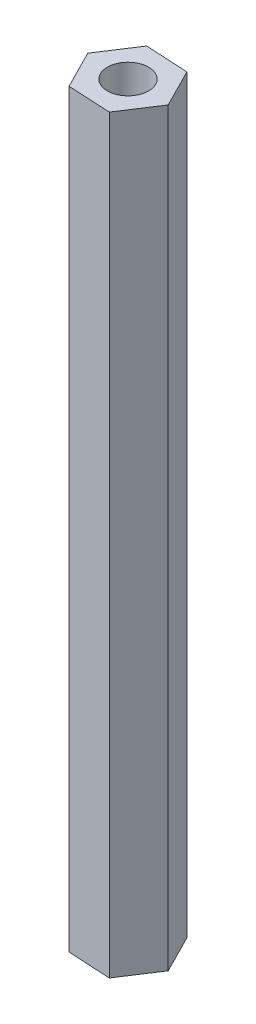
ISO-10303-21;
HEADER;
FILE_DESCRIPTION(('STEP AP214'),'2;1');
FILE_NAME('part.step','',(''),(''),'','','');
FILE_SCHEMA(('AUTOMOTIVE_DESIGN { 1 0 10303 214 1 1 1 1 }'));
ENDSEC;
DATA;
#1=APPLICATION_CONTEXT('core data for automotive mechanical design processes');
#2=APPLICATION_PROTOCOL_DEFINITION('international standard','automotive_design',2000,#1);
#3=PRODUCT_CONTEXT('',#1,'mechanical');
#4=PRODUCT('Part','Part','',(#3));
#5=PRODUCT_RELATED_PRODUCT_CATEGORY('part','',(#4));
#6=PRODUCT_DEFINITION_FORMATION('','',#4);
#7=PRODUCT_DEFINITION_CONTEXT('part definition',#1,'design');
#8=PRODUCT_DEFINITION('design','',#6,#7);
#9=PRODUCT_DEFINITION_SHAPE('','',#8);
#10=(LENGTH_UNIT() NAMED_UNIT(*) SI_UNIT(.MILLI.,.METRE.));
#11=(NAMED_UNIT(*) PLANE_ANGLE_UNIT() SI_UNIT($,.RADIAN.));
#12=(NAMED_UNIT(*) SI_UNIT($,.STERADIAN.) SOLID_ANGLE_UNIT());
#13=UNCERTAINTY_MEASURE_WITH_UNIT(LENGTH_MEASURE(1.E-05),#10,'distance_accuracy_value','');
#14=(GEOMETRIC_REPRESENTATION_CONTEXT(3) GLOBAL_UNCERTAINTY_ASSIGNED_CONTEXT((#13)) GLOBAL_UNIT_ASSIGNED_CONTEXT((#10,
#11,#12)) REPRESENTATION_CONTEXT('',''));
#15=CARTESIAN_POINT('',(0.,0.,0.));
#16=DIRECTION('',(0.,0.,1.));
#17=DIRECTION('',(1.,0.,0.));
#18=AXIS2_PLACEMENT_3D('',#15,#16,#17);
#19=CARTESIAN_POINT('',(1.54318664004275,60.,3.03675951094697));
#20=DIRECTION('',(-0.838083193513256,0.,-0.545542446332659));
#21=DIRECTION('',(-0.545542446332659,0.,0.838083193513256));
#22=AXIS2_PLACEMENT_3D('',#19,#20,#21);
#23=PLANE('',#22);
#24=DIRECTION('',(0.545542446332659,0.,-0.838083193513256));
#25=VECTOR('',#24,1.);
#26=CARTESIAN_POINT('',(1.54318664004275,0.,3.03675951094697));
#27=LINE('',#26,#25);
#28=CARTESIAN_POINT('',(1.54318664004275,0.,3.03675951094697));
#29=VERTEX_POINT('',#28);
#30=CARTESIAN_POINT('',(3.40150420168546,0.,0.181940922415713));
#31=VERTEX_POINT('',#30);
#32=EDGE_CURVE('E130',#29,#31,#27,.T.);
#33=ORIENTED_EDGE('',*,*,#32,.T.);
#34=DIRECTION('',(0.,-1.,0.));
#35=VECTOR('',#34,1.);
#36=CARTESIAN_POINT('',(3.40150420168546,60.,0.181940922415713));
#37=LINE('',#36,#35);
#38=CARTESIAN_POINT('',(3.40150420168546,60.,0.181940922415713));
#39=VERTEX_POINT('',#38);
#40=EDGE_CURVE('E11',#39,#31,#37,.T.);
#41=ORIENTED_EDGE('',*,*,#40,.F.);
#42=DIRECTION('',(0.545542446332659,0.,-0.838083193513256));
#43=VECTOR('',#42,1.);
#44=CARTESIAN_POINT('',(1.54318664004275,60.,3.03675951094697));
#45=LINE('',#44,#43);
#46=CARTESIAN_POINT('',(1.54318664004275,60.,3.03675951094697));
#47=VERTEX_POINT('',#46);
#48=EDGE_CURVE('E139',#47,#39,#45,.T.);
#49=ORIENTED_EDGE('',*,*,#48,.F.);
#50=DIRECTION('',(0.,-1.,0.));
#51=VECTOR('',#50,1.);
#52=CARTESIAN_POINT('',(1.54318664004275,60.,3.03675951094697));
#53=LINE('',#52,#51);
#54=EDGE_CURVE('E124',#47,#29,#53,.T.);
#55=ORIENTED_EDGE('',*,*,#54,.T.);
#56=EDGE_LOOP('',(#33,#41,#49,#55));
#57=FACE_BOUND('',#56,.T.);
#58=ADVANCED_FACE('F43',(#57),#23,.F.);
#59=CARTESIAN_POINT('',(3.40150420168546,60.,0.181940922415713));
#60=DIRECTION('',(-0.891495214123419,0.,0.45303011290094));
#61=DIRECTION('',(0.45303011290094,0.,0.891495214123419));
#62=AXIS2_PLACEMENT_3D('',#59,#60,#61);
#63=PLANE('',#62);
#64=DIRECTION('',(-0.45303011290094,0.,-0.891495214123419));
#65=VECTOR('',#64,1.);
#66=CARTESIAN_POINT('',(3.40150420168546,0.,0.181940922415713));
#67=LINE('',#66,#65);
#68=CARTESIAN_POINT('',(1.85831756164271,0.,-2.85481858853126));
#69=VERTEX_POINT('',#68);
#70=EDGE_CURVE('E128',#31,#69,#67,.T.);
#71=ORIENTED_EDGE('',*,*,#70,.T.);
#72=DIRECTION('',(0.,-1.,0.));
#73=VECTOR('',#72,1.);
#74=CARTESIAN_POINT('',(1.85831756164271,60.,-2.85481858853126));
#75=LINE('',#74,#73);
#76=CARTESIAN_POINT('',(1.85831756164271,60.,-2.85481858853126));
#77=VERTEX_POINT('',#76);
#78=EDGE_CURVE('E51',#77,#69,#75,.T.);
#79=ORIENTED_EDGE('',*,*,#78,.F.);
#80=DIRECTION('',(-0.45303011290094,0.,-0.891495214123419));
#81=VECTOR('',#80,1.);
#82=CARTESIAN_POINT('',(3.40150420168546,60.,0.181940922415713));
#83=LINE('',#82,#81);
#84=EDGE_CURVE('E96',#39,#77,#83,.T.);
#85=ORIENTED_EDGE('',*,*,#84,.F.);
#86=ORIENTED_EDGE('',*,*,#40,.T.);
#87=EDGE_LOOP('',(#71,#79,#85,#86));
#88=FACE_BOUND('',#87,.T.);
#89=ADVANCED_FACE('F162',(#88),#63,.F.);
#90=CARTESIAN_POINT('',(1.85831756164271,60.,-2.85481858853126));
#91=DIRECTION('',(-0.0534120206101634,0.,0.998572559233599));
#92=DIRECTION('',(0.998572559233599,0.,0.0534120206101634));
#93=AXIS2_PLACEMENT_3D('',#90,#91,#92);
#94=PLANE('',#93);
#95=DIRECTION('',(-0.998572559233599,0.,-0.0534120206101634));
#96=VECTOR('',#95,1.);
#97=CARTESIAN_POINT('',(1.85831756164271,0.,-2.85481858853126));
#98=LINE('',#97,#96);
#99=CARTESIAN_POINT('',(-1.54318664004275,0.,-3.03675951094697));
#100=VERTEX_POINT('',#99);
#101=EDGE_CURVE('E132',#69,#100,#98,.T.);
#102=ORIENTED_EDGE('',*,*,#101,.T.);
#103=DIRECTION('',(0.,-1.,0.));
#104=VECTOR('',#103,1.);
#105=CARTESIAN_POINT('',(-1.54318664004275,60.,-3.03675951094697));
#106=LINE('',#105,#104);
#107=CARTESIAN_POINT('',(-1.54318664004275,60.,-3.03675951094697));
#108=VERTEX_POINT('',#107);
#109=EDGE_CURVE('E117',#108,#100,#106,.T.);
#110=ORIENTED_EDGE('',*,*,#109,.F.);
#111=DIRECTION('',(-0.998572559233599,0.,-0.0534120206101634));
#112=VECTOR('',#111,1.);
#113=CARTESIAN_POINT('',(1.85831756164271,60.,-2.85481858853126));
#114=LINE('',#113,#112);
#115=EDGE_CURVE('E108',#77,#108,#114,.T.);
#116=ORIENTED_EDGE('',*,*,#115,.F.);
#117=ORIENTED_EDGE('',*,*,#78,.T.);
#118=EDGE_LOOP('',(#102,#110,#116,#117));
#119=FACE_BOUND('',#118,.T.);
#120=ADVANCED_FACE('F145',(#119),#94,.F.);
#121=CARTESIAN_POINT('',(-1.54318664004275,60.,-3.03675951094697));
#122=DIRECTION('',(0.838083193513256,0.,0.545542446332659));
#123=DIRECTION('',(0.545542446332659,0.,-0.838083193513256));
#124=AXIS2_PLACEMENT_3D('',#121,#122,#123);
#125=PLANE('',#124);
#126=DIRECTION('',(-0.545542446332659,0.,0.838083193513256));
#127=VECTOR('',#126,1.);
#128=CARTESIAN_POINT('',(-1.54318664004275,0.,-3.03675951094697));
#129=LINE('',#128,#127);
#130=CARTESIAN_POINT('',(-3.40150420168546,0.,-0.181940922415714));
#131=VERTEX_POINT('',#130);
#132=EDGE_CURVE('E119',#100,#131,#129,.T.);
#133=ORIENTED_EDGE('',*,*,#132,.T.);
#134=DIRECTION('',(0.,-1.,0.));
#135=VECTOR('',#134,1.);
#136=CARTESIAN_POINT('',(-3.40150420168546,60.,-0.181940922415714));
#137=LINE('',#136,#135);
#138=CARTESIAN_POINT('',(-3.40150420168546,60.,-0.181940922415714));
#139=VERTEX_POINT('',#138);
#140=EDGE_CURVE('E111',#139,#131,#137,.T.);
#141=ORIENTED_EDGE('',*,*,#140,.F.);
#142=DIRECTION('',(-0.545542446332659,0.,0.838083193513256));
#143=VECTOR('',#142,1.);
#144=CARTESIAN_POINT('',(-1.54318664004275,60.,-3.03675951094697));
#145=LINE('',#144,#143);
#146=EDGE_CURVE('E103',#108,#139,#145,.T.);
#147=ORIENTED_EDGE('',*,*,#146,.F.);
#148=ORIENTED_EDGE('',*,*,#109,.T.);
#149=EDGE_LOOP('',(#133,#141,#147,#148));
#150=FACE_BOUND('',#149,.T.);
#151=ADVANCED_FACE('F113',(#150),#125,.F.);
#152=CARTESIAN_POINT('',(-3.40150420168546,60.,-0.181940922415714));
#153=DIRECTION('',(0.89149521412342,0.,-0.45303011290094));
#154=DIRECTION('',(-0.45303011290094,0.,-0.89149521412342));
#155=AXIS2_PLACEMENT_3D('',#152,#153,#154);
#156=PLANE('',#155);
#157=DIRECTION('',(0.45303011290094,0.,0.891495214123419));
#158=VECTOR('',#157,1.);
#159=CARTESIAN_POINT('',(-3.40150420168546,0.,-0.181940922415714));
#160=LINE('',#159,#158);
#161=CARTESIAN_POINT('',(-1.85831756164271,0.,2.85481858853126));
#162=VERTEX_POINT('',#161);
#163=EDGE_CURVE('E82',#131,#162,#160,.T.);
#164=ORIENTED_EDGE('',*,*,#163,.T.);
#165=DIRECTION('',(0.,-1.,0.));
#166=VECTOR('',#165,1.);
#167=CARTESIAN_POINT('',(-1.85831756164271,60.,2.85481858853126));
#168=LINE('',#167,#166);
#169=CARTESIAN_POINT('',(-1.85831756164271,60.,2.85481858853126));
#170=VERTEX_POINT('',#169);
#171=EDGE_CURVE('E120',#170,#162,#168,.T.);
#172=ORIENTED_EDGE('',*,*,#171,.F.);
#173=DIRECTION('',(0.45303011290094,0.,0.891495214123419));
#174=VECTOR('',#173,1.);
#175=CARTESIAN_POINT('',(-3.40150420168546,60.,-0.181940922415714));
#176=LINE('',#175,#174);
#177=EDGE_CURVE('E110',#139,#170,#176,.T.);
#178=ORIENTED_EDGE('',*,*,#177,.F.);
#179=ORIENTED_EDGE('',*,*,#140,.T.);
#180=EDGE_LOOP('',(#164,#172,#178,#179));
#181=FACE_BOUND('',#180,.T.);
#182=ADVANCED_FACE('F121',(#181),#156,.F.);
#183=CARTESIAN_POINT('',(-1.85831756164271,60.,2.85481858853126));
#184=DIRECTION('',(0.0534120206101633,0.,-0.998572559233599));
#185=DIRECTION('',(-0.998572559233599,0.,-0.0534120206101634));
#186=AXIS2_PLACEMENT_3D('',#183,#184,#185);
#187=PLANE('',#186);
#188=DIRECTION('',(0.998572559233599,0.,0.0534120206101633));
#189=VECTOR('',#188,1.);
#190=CARTESIAN_POINT('',(-1.85831756164271,0.,2.85481858853126));
#191=LINE('',#190,#189);
#192=EDGE_CURVE('E86',#162,#29,#191,.T.);
#193=ORIENTED_EDGE('',*,*,#192,.T.);
#194=ORIENTED_EDGE('',*,*,#54,.F.);
#195=DIRECTION('',(0.998572559233599,0.,0.0534120206101633));
#196=VECTOR('',#195,1.);
#197=CARTESIAN_POINT('',(-1.85831756164271,60.,2.85481858853126));
#198=LINE('',#197,#196);
#199=EDGE_CURVE('E56',#170,#47,#198,.T.);
#200=ORIENTED_EDGE('',*,*,#199,.F.);
#201=ORIENTED_EDGE('',*,*,#171,.T.);
#202=EDGE_LOOP('',(#193,#194,#200,#201));
#203=FACE_BOUND('',#202,.T.);
#204=ADVANCED_FACE('F151',(#203),#187,.F.);
#205=CARTESIAN_POINT('',(0.,60.,0.));
#206=DIRECTION('',(0.,1.,0.));
#207=DIRECTION('',(0.,0.,1.));
#208=AXIS2_PLACEMENT_3D('',#205,#206,#207);
#209=PLANE('',#208);
#210=CARTESIAN_POINT('',(0.,60.,0.));
#211=DIRECTION('',(0.,1.,0.));
#212=DIRECTION('',(0.,0.,1.));
#213=AXIS2_PLACEMENT_3D('',#210,#211,#212);
#214=CIRCLE('',#213,1.64999999999999);
#215=CARTESIAN_POINT('',(0.,60.,1.64999999999999));
#216=VERTEX_POINT('',#215);
#217=EDGE_CURVE('E222',#216,#216,#214,.T.);
#218=ORIENTED_EDGE('',*,*,#217,.F.);
#219=EDGE_LOOP('',(#218));
#220=FACE_BOUND('',#219,.T.);
#221=ORIENTED_EDGE('',*,*,#48,.T.);
#222=ORIENTED_EDGE('',*,*,#84,.T.);
#223=ORIENTED_EDGE('',*,*,#115,.T.);
#224=ORIENTED_EDGE('',*,*,#146,.T.);
#225=ORIENTED_EDGE('',*,*,#177,.T.);
#226=ORIENTED_EDGE('',*,*,#199,.T.);
#227=EDGE_LOOP('',(#221,#222,#223,#224,#225,#226));
#228=FACE_BOUND('',#227,.T.);
#229=ADVANCED_FACE('F104',(#220,#228),#209,.T.);
#230=CARTESIAN_POINT('',(0.,0.,0.));
#231=DIRECTION('',(0.,1.,0.));
#232=DIRECTION('',(0.,0.,1.));
#233=AXIS2_PLACEMENT_3D('',#230,#231,#232);
#234=PLANE('',#233);
#235=CARTESIAN_POINT('',(0.,0.,0.));
#236=DIRECTION('',(0.,1.,0.));
#237=DIRECTION('',(0.,0.,1.));
#238=AXIS2_PLACEMENT_3D('',#235,#236,#237);
#239=CIRCLE('',#238,1.64999999999999);
#240=CARTESIAN_POINT('',(0.,0.,1.64999999999999));
#241=VERTEX_POINT('',#240);
#242=EDGE_CURVE('E133',#241,#241,#239,.T.);
#243=ORIENTED_EDGE('',*,*,#242,.T.);
#244=EDGE_LOOP('',(#243));
#245=FACE_BOUND('',#244,.T.);
#246=ORIENTED_EDGE('',*,*,#32,.F.);
#247=ORIENTED_EDGE('',*,*,#192,.F.);
#248=ORIENTED_EDGE('',*,*,#163,.F.);
#249=ORIENTED_EDGE('',*,*,#132,.F.);
#250=ORIENTED_EDGE('',*,*,#101,.F.);
#251=ORIENTED_EDGE('',*,*,#70,.F.);
#252=EDGE_LOOP('',(#246,#247,#248,#249,#250,#251));
#253=FACE_BOUND('',#252,.T.);
#254=ADVANCED_FACE('F150',(#245,#253),#234,.F.);
#255=CARTESIAN_POINT('',(0.,60.,0.));
#256=DIRECTION('',(0.,1.,0.));
#257=DIRECTION('',(0.,0.,1.));
#258=AXIS2_PLACEMENT_3D('',#255,#256,#257);
#259=CYLINDRICAL_SURFACE('',#258,1.64999999999999);
#260=ORIENTED_EDGE('',*,*,#242,.F.);
#261=EDGE_LOOP('',(#260));
#262=FACE_BOUND('',#261,.T.);
#263=ORIENTED_EDGE('',*,*,#217,.T.);
#264=EDGE_LOOP('',(#263));
#265=FACE_BOUND('',#264,.T.);
#266=ADVANCED_FACE('F205',(#262,#265),#259,.F.);
#267=CLOSED_SHELL('',(#58,#89,#120,#151,#182,#204,#229,#254,#266));
#268=MANIFOLD_SOLID_BREP('B2',#267);
#269=ADVANCED_BREP_SHAPE_REPRESENTATION('',(#18,#268),#14);
#270=SHAPE_DEFINITION_REPRESENTATION(#9,#269);
ENDSEC;
END-ISO-10303-21;
